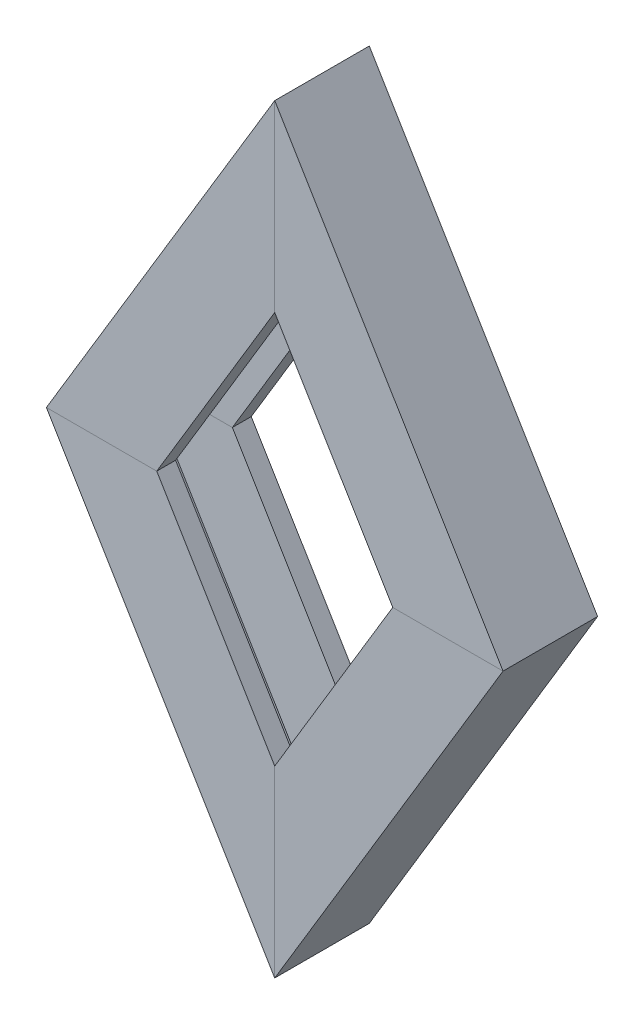
ISO-10303-21;
HEADER;
FILE_DESCRIPTION(('STEP AP214'),'2;1');
FILE_NAME('part.step','',(''),(''),'','','');
FILE_SCHEMA(('AUTOMOTIVE_DESIGN { 1 0 10303 214 1 1 1 1 }'));
ENDSEC;
DATA;
#1=APPLICATION_CONTEXT('core data for automotive mechanical design processes');
#2=APPLICATION_PROTOCOL_DEFINITION('international standard','automotive_design',2000,#1);
#3=PRODUCT_CONTEXT('',#1,'mechanical');
#4=PRODUCT('Part','Part','',(#3));
#5=PRODUCT_RELATED_PRODUCT_CATEGORY('part','',(#4));
#6=PRODUCT_DEFINITION_FORMATION('','',#4);
#7=PRODUCT_DEFINITION_CONTEXT('part definition',#1,'design');
#8=PRODUCT_DEFINITION('design','',#6,#7);
#9=PRODUCT_DEFINITION_SHAPE('','',#8);
#10=(LENGTH_UNIT() NAMED_UNIT(*) SI_UNIT(.MILLI.,.METRE.));
#11=(NAMED_UNIT(*) PLANE_ANGLE_UNIT() SI_UNIT($,.RADIAN.));
#12=(NAMED_UNIT(*) SI_UNIT($,.STERADIAN.) SOLID_ANGLE_UNIT());
#13=UNCERTAINTY_MEASURE_WITH_UNIT(LENGTH_MEASURE(1.E-05),#10,'distance_accuracy_value','');
#14=(GEOMETRIC_REPRESENTATION_CONTEXT(3) GLOBAL_UNCERTAINTY_ASSIGNED_CONTEXT((#13)) GLOBAL_UNIT_ASSIGNED_CONTEXT((#10,
#11,#12)) REPRESENTATION_CONTEXT('',''));
#15=CARTESIAN_POINT('',(0.,0.,0.));
#16=DIRECTION('',(0.,0.,1.));
#17=DIRECTION('',(1.,0.,0.));
#18=AXIS2_PLACEMENT_3D('',#15,#16,#17);
#19=CARTESIAN_POINT('',(21.4285714285715,291.923031159057,-15.0000000000001));
#20=DIRECTION('',(-0.857142857142858,0.515078753637713,0.));
#21=DIRECTION('',(-0.515078753637713,-0.857142857142857,0.));
#22=AXIS2_PLACEMENT_3D('',#19,#20,#21);
#23=PLANE('',#22);
#24=DIRECTION('',(0.,0.,1.));
#25=VECTOR('',#24,1.);
#26=CARTESIAN_POINT('',(-62.4143357301187,152.4,-14.9999999999995));
#27=LINE('',#26,#25);
#28=CARTESIAN_POINT('',(-62.4143357301187,152.4,-25.0000000000001));
#29=VERTEX_POINT('',#28);
#30=CARTESIAN_POINT('',(-62.4143357301187,152.4,-15.0000000000001));
#31=VERTEX_POINT('',#30);
#32=EDGE_CURVE('E149',#29,#31,#27,.T.);
#33=ORIENTED_EDGE('',*,*,#32,.F.);
#34=DIRECTION('',(-0.515078753637713,-0.857142857142857,0.));
#35=VECTOR('',#34,1.);
#36=CARTESIAN_POINT('',(21.4285714285714,291.923031159057,-25.0000000000001));
#37=LINE('',#36,#35);
#38=CARTESIAN_POINT('',(0.,256.263732830292,-25.0000000000001));
#39=VERTEX_POINT('',#38);
#40=EDGE_CURVE('E180',#39,#29,#37,.T.);
#41=ORIENTED_EDGE('',*,*,#40,.F.);
#42=DIRECTION('',(0.,0.,-1.));
#43=VECTOR('',#42,1.);
#44=CARTESIAN_POINT('',(0.,256.263732830292,-15.));
#45=LINE('',#44,#43);
#46=CARTESIAN_POINT('',(0.,256.263732830292,-15.0000000000001));
#47=VERTEX_POINT('',#46);
#48=EDGE_CURVE('E140',#47,#39,#45,.T.);
#49=ORIENTED_EDGE('',*,*,#48,.F.);
#50=DIRECTION('',(-0.515078753637713,-0.857142857142857,0.));
#51=VECTOR('',#50,1.);
#52=CARTESIAN_POINT('',(21.4285714285715,291.923031159057,-15.0000000000001));
#53=LINE('',#52,#51);
#54=EDGE_CURVE('E79',#47,#31,#53,.T.);
#55=ORIENTED_EDGE('',*,*,#54,.T.);
#56=EDGE_LOOP('',(#33,#41,#49,#55));
#57=FACE_BOUND('',#56,.T.);
#58=ADVANCED_FACE('F75',(#57),#23,.F.);
#59=CARTESIAN_POINT('',(21.4285714285714,291.923031159057,-25.0000000000001));
#60=DIRECTION('',(0.,0.,1.));
#61=DIRECTION('',(1.,0.,0.));
#62=AXIS2_PLACEMENT_3D('',#59,#60,#61);
#63=PLANE('',#62);
#64=DIRECTION('',(1.,0.,0.));
#65=VECTOR('',#64,1.);
#66=CARTESIAN_POINT('',(21.4285714285715,152.4,-25.0000000000004));
#67=LINE('',#66,#65);
#68=CARTESIAN_POINT('',(-120.747669063452,152.4,-24.9999999999999));
#69=VERTEX_POINT('',#68);
#70=EDGE_CURVE('E146',#69,#29,#67,.T.);
#71=ORIENTED_EDGE('',*,*,#70,.F.);
#72=DIRECTION('',(-0.515078753637713,-0.857142857142857,0.));
#73=VECTOR('',#72,1.);
#74=CARTESIAN_POINT('',(-21.4285714285715,317.676968840943,-24.9999999999999));
#75=LINE('',#74,#73);
#76=CARTESIAN_POINT('',(0.,353.336267169708,-24.9999999999999));
#77=VERTEX_POINT('',#76);
#78=EDGE_CURVE('E178',#77,#69,#75,.T.);
#79=ORIENTED_EDGE('',*,*,#78,.F.);
#80=DIRECTION('',(0.,1.,0.));
#81=VECTOR('',#80,1.);
#82=CARTESIAN_POINT('',(0.,291.923031159057,-25.));
#83=LINE('',#82,#81);
#84=EDGE_CURVE('E204',#39,#77,#83,.T.);
#85=ORIENTED_EDGE('',*,*,#84,.F.);
#86=ORIENTED_EDGE('',*,*,#40,.T.);
#87=EDGE_LOOP('',(#71,#79,#85,#86));
#88=FACE_BOUND('',#87,.T.);
#89=ADVANCED_FACE('F194',(#88),#63,.F.);
#90=CARTESIAN_POINT('',(-21.4285714285715,317.676968840943,-24.9999999999999));
#91=DIRECTION('',(0.857142857142858,-0.515078753637713,0.));
#92=DIRECTION('',(0.515078753637713,0.857142857142857,0.));
#93=AXIS2_PLACEMENT_3D('',#90,#91,#92);
#94=PLANE('',#93);
#95=DIRECTION('',(0.,0.,-1.));
#96=VECTOR('',#95,1.);
#97=CARTESIAN_POINT('',(-120.747669063452,152.4,-24.9999999999991));
#98=LINE('',#97,#96);
#99=CARTESIAN_POINT('',(-120.747669063452,152.4,25.0000000000001));
#100=VERTEX_POINT('',#99);
#101=EDGE_CURVE('E14',#100,#69,#98,.T.);
#102=ORIENTED_EDGE('',*,*,#101,.F.);
#103=DIRECTION('',(-0.515078753637713,-0.857142857142857,0.));
#104=VECTOR('',#103,1.);
#105=CARTESIAN_POINT('',(-21.4285714285713,317.676968840943,25.0000000000001));
#106=LINE('',#105,#104);
#107=CARTESIAN_POINT('',(0.,353.336267169707,25.0000000000001));
#108=VERTEX_POINT('',#107);
#109=EDGE_CURVE('E175',#108,#100,#106,.T.);
#110=ORIENTED_EDGE('',*,*,#109,.F.);
#111=DIRECTION('',(0.,0.,1.));
#112=VECTOR('',#111,1.);
#113=CARTESIAN_POINT('',(0.,353.336267169708,-24.9999999999999));
#114=LINE('',#113,#112);
#115=EDGE_CURVE('E201',#77,#108,#114,.T.);
#116=ORIENTED_EDGE('',*,*,#115,.F.);
#117=ORIENTED_EDGE('',*,*,#78,.T.);
#118=EDGE_LOOP('',(#102,#110,#116,#117));
#119=FACE_BOUND('',#118,.T.);
#120=ADVANCED_FACE('F198',(#119),#94,.F.);
#121=CARTESIAN_POINT('',(-21.4285714285713,317.676968840943,25.0000000000001));
#122=DIRECTION('',(0.,0.,-1.));
#123=DIRECTION('',(-1.,0.,0.));
#124=AXIS2_PLACEMENT_3D('',#121,#122,#123);
#125=PLANE('',#124);
#126=DIRECTION('',(-1.,0.,0.));
#127=VECTOR('',#126,1.);
#128=CARTESIAN_POINT('',(-21.4285714285713,152.4,24.9999999999998));
#129=LINE('',#128,#127);
#130=CARTESIAN_POINT('',(-62.4143357301184,152.4,24.9999999999999));
#131=VERTEX_POINT('',#130);
#132=EDGE_CURVE('E84',#131,#100,#129,.T.);
#133=ORIENTED_EDGE('',*,*,#132,.F.);
#134=DIRECTION('',(-0.515078753637713,-0.857142857142857,0.));
#135=VECTOR('',#134,1.);
#136=CARTESIAN_POINT('',(21.4285714285716,291.923031159057,24.9999999999999));
#137=LINE('',#136,#135);
#138=CARTESIAN_POINT('',(0.,256.263732830292,24.9999999999999));
#139=VERTEX_POINT('',#138);
#140=EDGE_CURVE('E172',#139,#131,#137,.T.);
#141=ORIENTED_EDGE('',*,*,#140,.F.);
#142=DIRECTION('',(0.,-1.,0.));
#143=VECTOR('',#142,1.);
#144=CARTESIAN_POINT('',(0.,317.676968840943,25.));
#145=LINE('',#144,#143);
#146=EDGE_CURVE('E203',#108,#139,#145,.T.);
#147=ORIENTED_EDGE('',*,*,#146,.F.);
#148=ORIENTED_EDGE('',*,*,#109,.T.);
#149=EDGE_LOOP('',(#133,#141,#147,#148));
#150=FACE_BOUND('',#149,.T.);
#151=ADVANCED_FACE('F216',(#150),#125,.F.);
#152=CARTESIAN_POINT('',(21.4285714285716,291.923031159057,24.9999999999999));
#153=DIRECTION('',(-0.857142857142858,0.515078753637713,0.));
#154=DIRECTION('',(-0.515078753637713,-0.857142857142857,0.));
#155=AXIS2_PLACEMENT_3D('',#152,#153,#154);
#156=PLANE('',#155);
#157=DIRECTION('',(0.,0.,1.));
#158=VECTOR('',#157,1.);
#159=CARTESIAN_POINT('',(-62.4143357301184,152.4,25.0000000000006));
#160=LINE('',#159,#158);
#161=CARTESIAN_POINT('',(-62.4143357301185,152.4,14.9999999999999));
#162=VERTEX_POINT('',#161);
#163=EDGE_CURVE('E160',#162,#131,#160,.T.);
#164=ORIENTED_EDGE('',*,*,#163,.F.);
#165=DIRECTION('',(-0.515078753637713,-0.857142857142857,0.));
#166=VECTOR('',#165,1.);
#167=CARTESIAN_POINT('',(21.4285714285716,291.923031159057,14.9999999999999));
#168=LINE('',#167,#166);
#169=CARTESIAN_POINT('',(0.,256.263732830292,14.9999999999999));
#170=VERTEX_POINT('',#169);
#171=EDGE_CURVE('E169',#170,#162,#168,.T.);
#172=ORIENTED_EDGE('',*,*,#171,.F.);
#173=DIRECTION('',(0.,0.,-1.));
#174=VECTOR('',#173,1.);
#175=CARTESIAN_POINT('',(1.04083408558608E-13,256.263732830292,24.9999999999999));
#176=LINE('',#175,#174);
#177=EDGE_CURVE('E151',#139,#170,#176,.T.);
#178=ORIENTED_EDGE('',*,*,#177,.F.);
#179=ORIENTED_EDGE('',*,*,#140,.T.);
#180=EDGE_LOOP('',(#164,#172,#178,#179));
#181=FACE_BOUND('',#180,.T.);
#182=ADVANCED_FACE('F213',(#181),#156,.F.);
#183=CARTESIAN_POINT('',(21.4285714285716,291.923031159057,14.9999999999999));
#184=DIRECTION('',(0.,0.,1.));
#185=DIRECTION('',(1.,0.,0.));
#186=AXIS2_PLACEMENT_3D('',#183,#184,#185);
#187=PLANE('',#186);
#188=DIRECTION('',(1.,0.,0.));
#189=VECTOR('',#188,1.);
#190=CARTESIAN_POINT('',(21.4285714285717,152.4,14.9999999999997));
#191=LINE('',#190,#189);
#192=CARTESIAN_POINT('',(-109.081002396785,152.4,15.0000000000001));
#193=VERTEX_POINT('',#192);
#194=EDGE_CURVE('E163',#193,#162,#191,.T.);
#195=ORIENTED_EDGE('',*,*,#194,.F.);
#196=DIRECTION('',(-0.515078753637713,-0.857142857142857,0.));
#197=VECTOR('',#196,1.);
#198=CARTESIAN_POINT('',(-12.8571428571428,312.526181304566,15.0000000000001));
#199=LINE('',#198,#197);
#200=CARTESIAN_POINT('',(0.,333.921760301824,15.0000000000001));
#201=VERTEX_POINT('',#200);
#202=EDGE_CURVE('E134',#201,#193,#199,.T.);
#203=ORIENTED_EDGE('',*,*,#202,.F.);
#204=DIRECTION('',(0.,1.,0.));
#205=VECTOR('',#204,1.);
#206=CARTESIAN_POINT('',(0.,291.923031159057,15.));
#207=LINE('',#206,#205);
#208=EDGE_CURVE('E145',#170,#201,#207,.T.);
#209=ORIENTED_EDGE('',*,*,#208,.F.);
#210=ORIENTED_EDGE('',*,*,#171,.T.);
#211=EDGE_LOOP('',(#195,#203,#209,#210));
#212=FACE_BOUND('',#211,.T.);
#213=ADVANCED_FACE('F221',(#212),#187,.F.);
#214=CARTESIAN_POINT('',(-12.8571428571428,312.526181304566,15.0000000000001));
#215=DIRECTION('',(-0.857142857142858,0.515078753637713,0.));
#216=DIRECTION('',(-0.515078753637713,-0.857142857142857,0.));
#217=AXIS2_PLACEMENT_3D('',#214,#215,#216);
#218=PLANE('',#217);
#219=DIRECTION('',(0.,0.,1.));
#220=VECTOR('',#219,1.);
#221=CARTESIAN_POINT('',(-109.081002396785,152.4,15.0000000000008));
#222=LINE('',#221,#220);
#223=CARTESIAN_POINT('',(-109.081002396785,152.4,-15.));
#224=VERTEX_POINT('',#223);
#225=EDGE_CURVE('E131',#224,#193,#222,.T.);
#226=ORIENTED_EDGE('',*,*,#225,.F.);
#227=DIRECTION('',(-0.515078753637713,-0.857142857142857,0.));
#228=VECTOR('',#227,1.);
#229=CARTESIAN_POINT('',(-12.8571428571429,312.526181304566,-15.));
#230=LINE('',#229,#228);
#231=CARTESIAN_POINT('',(0.,333.921760301825,-15.));
#232=VERTEX_POINT('',#231);
#233=EDGE_CURVE('E92',#232,#224,#230,.T.);
#234=ORIENTED_EDGE('',*,*,#233,.F.);
#235=DIRECTION('',(0.,0.,-1.));
#236=VECTOR('',#235,1.);
#237=CARTESIAN_POINT('',(0.,333.921760301824,15.0000000000001));
#238=LINE('',#237,#236);
#239=EDGE_CURVE('E128',#201,#232,#238,.T.);
#240=ORIENTED_EDGE('',*,*,#239,.F.);
#241=ORIENTED_EDGE('',*,*,#202,.T.);
#242=EDGE_LOOP('',(#226,#234,#240,#241));
#243=FACE_BOUND('',#242,.T.);
#244=ADVANCED_FACE('F125',(#243),#218,.F.);
#245=CARTESIAN_POINT('',(-12.8571428571429,312.526181304566,-15.));
#246=DIRECTION('',(0.,0.,-1.));
#247=DIRECTION('',(-1.,0.,0.));
#248=AXIS2_PLACEMENT_3D('',#245,#246,#247);
#249=PLANE('',#248);
#250=DIRECTION('',(-1.,0.,0.));
#251=VECTOR('',#250,1.);
#252=CARTESIAN_POINT('',(-12.8571428571428,152.4,-15.0000000000002));
#253=LINE('',#252,#251);
#254=EDGE_CURVE('E156',#31,#224,#253,.T.);
#255=ORIENTED_EDGE('',*,*,#254,.F.);
#256=ORIENTED_EDGE('',*,*,#54,.F.);
#257=DIRECTION('',(0.,-1.,0.));
#258=VECTOR('',#257,1.);
#259=CARTESIAN_POINT('',(0.,312.526181304566,-15.));
#260=LINE('',#259,#258);
#261=EDGE_CURVE('E133',#232,#47,#260,.T.);
#262=ORIENTED_EDGE('',*,*,#261,.F.);
#263=ORIENTED_EDGE('',*,*,#233,.T.);
#264=EDGE_LOOP('',(#255,#256,#262,#263));
#265=FACE_BOUND('',#264,.T.);
#266=ADVANCED_FACE('F137',(#265),#249,.F.);
#267=CARTESIAN_POINT('',(0.,304.8,0.));
#268=DIRECTION('',(1.,0.,0.));
#269=DIRECTION('',(0.,0.,-1.));
#270=AXIS2_PLACEMENT_3D('',#267,#268,#269);
#271=PLANE('',#270);
#272=ORIENTED_EDGE('',*,*,#261,.T.);
#273=ORIENTED_EDGE('',*,*,#48,.T.);
#274=ORIENTED_EDGE('',*,*,#84,.T.);
#275=ORIENTED_EDGE('',*,*,#115,.T.);
#276=ORIENTED_EDGE('',*,*,#146,.T.);
#277=ORIENTED_EDGE('',*,*,#177,.T.);
#278=ORIENTED_EDGE('',*,*,#208,.T.);
#279=ORIENTED_EDGE('',*,*,#239,.T.);
#280=EDGE_LOOP('',(#272,#273,#274,#275,#276,#277,#278,#279));
#281=FACE_BOUND('',#280,.T.);
#282=ADVANCED_FACE('F143',(#281),#271,.T.);
#283=CARTESIAN_POINT('',(-91.5810023967853,152.4,0.));
#284=DIRECTION('',(0.,-1.,0.));
#285=DIRECTION('',(0.,0.,-1.));
#286=AXIS2_PLACEMENT_3D('',#283,#284,#285);
#287=PLANE('',#286);
#288=ORIENTED_EDGE('',*,*,#70,.T.);
#289=ORIENTED_EDGE('',*,*,#32,.T.);
#290=ORIENTED_EDGE('',*,*,#254,.T.);
#291=ORIENTED_EDGE('',*,*,#225,.T.);
#292=ORIENTED_EDGE('',*,*,#194,.T.);
#293=ORIENTED_EDGE('',*,*,#163,.T.);
#294=ORIENTED_EDGE('',*,*,#132,.T.);
#295=ORIENTED_EDGE('',*,*,#101,.T.);
#296=EDGE_LOOP('',(#288,#289,#290,#291,#292,#293,#294,#295));
#297=FACE_BOUND('',#296,.T.);
#298=ADVANCED_FACE('F77',(#297),#287,.T.);
#299=CLOSED_SHELL('',(#58,#89,#120,#151,#182,#213,#244,#266,#282,#298));
#300=MANIFOLD_SOLID_BREP('B2',#299);
#301=CARTESIAN_POINT('',(-70.1524309682139,165.276968840943,-15.0000000000001));
#302=DIRECTION('',(-0.857142857142858,-0.515078753637713,0.));
#303=DIRECTION('',(0.515078753637713,-0.857142857142857,0.));
#304=AXIS2_PLACEMENT_3D('',#301,#302,#303);
#305=PLANE('',#304);
#306=DIRECTION('',(0.,0.,-1.));
#307=VECTOR('',#306,1.);
#308=CARTESIAN_POINT('',(-62.4143357301187,152.4,-15.0000000000001));
#309=LINE('',#308,#307);
#310=CARTESIAN_POINT('',(-62.4143357301187,152.4,-15.0000000000001));
#311=VERTEX_POINT('',#310);
#312=CARTESIAN_POINT('',(-62.4143357301187,152.4,-25.0000000000001));
#313=VERTEX_POINT('',#312);
#314=EDGE_CURVE('E448',#311,#313,#309,.T.);
#315=ORIENTED_EDGE('',*,*,#314,.F.);
#316=DIRECTION('',(0.515078753637713,-0.857142857142857,0.));
#317=VECTOR('',#316,1.);
#318=CARTESIAN_POINT('',(-70.1524309682139,165.276968840943,-15.0000000000001));
#319=LINE('',#318,#317);
#320=CARTESIAN_POINT('',(0.,48.5362671697074,-15.0000000000001));
#321=VERTEX_POINT('',#320);
#322=EDGE_CURVE('E353',#311,#321,#319,.T.);
#323=ORIENTED_EDGE('',*,*,#322,.T.);
#324=DIRECTION('',(0.,0.,1.));
#325=VECTOR('',#324,1.);
#326=CARTESIAN_POINT('',(0.,48.5362671697074,-14.9999999999988));
#327=LINE('',#326,#325);
#328=CARTESIAN_POINT('',(0.,48.5362671697073,-25.0000000000001));
#329=VERTEX_POINT('',#328);
#330=EDGE_CURVE('E467',#329,#321,#327,.T.);
#331=ORIENTED_EDGE('',*,*,#330,.F.);
#332=DIRECTION('',(0.515078753637713,-0.857142857142857,0.));
#333=VECTOR('',#332,1.);
#334=CARTESIAN_POINT('',(-70.1524309682139,165.276968840943,-25.0000000000001));
#335=LINE('',#334,#333);
#336=EDGE_CURVE('E461',#313,#329,#335,.T.);
#337=ORIENTED_EDGE('',*,*,#336,.F.);
#338=EDGE_LOOP('',(#315,#323,#331,#337));
#339=FACE_BOUND('',#338,.T.);
#340=ADVANCED_FACE('F349',(#339),#305,.F.);
#341=CARTESIAN_POINT('',(-70.1524309682139,165.276968840943,-25.0000000000001));
#342=DIRECTION('',(0.,0.,1.));
#343=DIRECTION('',(1.,0.,0.));
#344=AXIS2_PLACEMENT_3D('',#341,#342,#343);
#345=PLANE('',#344);
#346=DIRECTION('',(-1.,0.,0.));
#347=VECTOR('',#346,1.);
#348=CARTESIAN_POINT('',(-70.1524309682139,152.4,-25.0000000000001));
#349=LINE('',#348,#347);
#350=CARTESIAN_POINT('',(-120.747669063452,152.4,-24.9999999999999));
#351=VERTEX_POINT('',#350);
#352=EDGE_CURVE('E408',#313,#351,#349,.T.);
#353=ORIENTED_EDGE('',*,*,#352,.F.);
#354=ORIENTED_EDGE('',*,*,#336,.T.);
#355=DIRECTION('',(0.,1.,0.));
#356=VECTOR('',#355,1.);
#357=CARTESIAN_POINT('',(0.,165.276968840943,-25.0000000000003));
#358=LINE('',#357,#356);
#359=CARTESIAN_POINT('',(0.,-48.5362671697076,-24.9999999999999));
#360=VERTEX_POINT('',#359);
#361=EDGE_CURVE('E455',#360,#329,#358,.T.);
#362=ORIENTED_EDGE('',*,*,#361,.F.);
#363=DIRECTION('',(0.515078753637713,-0.857142857142857,0.));
#364=VECTOR('',#363,1.);
#365=CARTESIAN_POINT('',(-113.009573825357,139.523031159057,-24.9999999999999));
#366=LINE('',#365,#364);
#367=EDGE_CURVE('E460',#351,#360,#366,.T.);
#368=ORIENTED_EDGE('',*,*,#367,.F.);
#369=EDGE_LOOP('',(#353,#354,#362,#368));
#370=FACE_BOUND('',#369,.T.);
#371=ADVANCED_FACE('F463',(#370),#345,.F.);
#372=CARTESIAN_POINT('',(-113.009573825357,139.523031159057,-24.9999999999999));
#373=DIRECTION('',(0.857142857142858,0.515078753637713,0.));
#374=DIRECTION('',(-0.515078753637713,0.857142857142857,0.));
#375=AXIS2_PLACEMENT_3D('',#372,#373,#374);
#376=PLANE('',#375);
#377=DIRECTION('',(0.,0.,1.));
#378=VECTOR('',#377,1.);
#379=CARTESIAN_POINT('',(-120.747669063452,152.4,-24.9999999999999));
#380=LINE('',#379,#378);
#381=CARTESIAN_POINT('',(-120.747669063452,152.4,25.0000000000001));
#382=VERTEX_POINT('',#381);
#383=EDGE_CURVE('E443',#351,#382,#380,.T.);
#384=ORIENTED_EDGE('',*,*,#383,.F.);
#385=ORIENTED_EDGE('',*,*,#367,.T.);
#386=DIRECTION('',(0.,0.,-1.));
#387=VECTOR('',#386,1.);
#388=CARTESIAN_POINT('',(0.,-48.5362671697078,-24.9999999999975));
#389=LINE('',#388,#387);
#390=CARTESIAN_POINT('',(0.,-48.5362671697072,25.0000000000001));
#391=VERTEX_POINT('',#390);
#392=EDGE_CURVE('E453',#391,#360,#389,.T.);
#393=ORIENTED_EDGE('',*,*,#392,.F.);
#394=DIRECTION('',(0.515078753637713,-0.857142857142857,0.));
#395=VECTOR('',#394,1.);
#396=CARTESIAN_POINT('',(-113.009573825357,139.523031159057,25.0000000000001));
#397=LINE('',#396,#395);
#398=EDGE_CURVE('E458',#382,#391,#397,.T.);
#399=ORIENTED_EDGE('',*,*,#398,.F.);
#400=EDGE_LOOP('',(#384,#385,#393,#399));
#401=FACE_BOUND('',#400,.T.);
#402=ADVANCED_FACE('F501',(#401),#376,.F.);
#403=CARTESIAN_POINT('',(-113.009573825357,139.523031159057,25.0000000000001));
#404=DIRECTION('',(0.,0.,-1.));
#405=DIRECTION('',(-1.,0.,0.));
#406=AXIS2_PLACEMENT_3D('',#403,#404,#405);
#407=PLANE('',#406);
#408=DIRECTION('',(1.,0.,0.));
#409=VECTOR('',#408,1.);
#410=CARTESIAN_POINT('',(-113.009573825357,152.4,25.0000000000001));
#411=LINE('',#410,#409);
#412=CARTESIAN_POINT('',(-62.4143357301186,152.4,24.9999999999999));
#413=VERTEX_POINT('',#412);
#414=EDGE_CURVE('E441',#382,#413,#411,.T.);
#415=ORIENTED_EDGE('',*,*,#414,.F.);
#416=ORIENTED_EDGE('',*,*,#398,.T.);
#417=DIRECTION('',(0.,-1.,0.));
#418=VECTOR('',#417,1.);
#419=CARTESIAN_POINT('',(0.,139.523031159057,24.9999999999998));
#420=LINE('',#419,#418);
#421=CARTESIAN_POINT('',(0.,48.5362671697078,24.9999999999999));
#422=VERTEX_POINT('',#421);
#423=EDGE_CURVE('E478',#422,#391,#420,.T.);
#424=ORIENTED_EDGE('',*,*,#423,.F.);
#425=DIRECTION('',(0.515078753637713,-0.857142857142857,0.));
#426=VECTOR('',#425,1.);
#427=CARTESIAN_POINT('',(-70.1524309682138,165.276968840943,24.9999999999999));
#428=LINE('',#427,#426);
#429=EDGE_CURVE('E436',#413,#422,#428,.T.);
#430=ORIENTED_EDGE('',*,*,#429,.F.);
#431=EDGE_LOOP('',(#415,#416,#424,#430));
#432=FACE_BOUND('',#431,.T.);
#433=ADVANCED_FACE('F506',(#432),#407,.F.);
#434=CARTESIAN_POINT('',(-70.1524309682138,165.276968840943,24.9999999999999));
#435=DIRECTION('',(-0.857142857142858,-0.515078753637713,0.));
#436=DIRECTION('',(0.515078753637713,-0.857142857142857,0.));
#437=AXIS2_PLACEMENT_3D('',#434,#435,#436);
#438=PLANE('',#437);
#439=DIRECTION('',(0.,0.,-1.));
#440=VECTOR('',#439,1.);
#441=CARTESIAN_POINT('',(-62.4143357301186,152.4,24.9999999999999));
#442=LINE('',#441,#440);
#443=CARTESIAN_POINT('',(-62.4143357301186,152.4,14.9999999999999));
#444=VERTEX_POINT('',#443);
#445=EDGE_CURVE('E428',#413,#444,#442,.T.);
#446=ORIENTED_EDGE('',*,*,#445,.F.);
#447=ORIENTED_EDGE('',*,*,#429,.T.);
#448=DIRECTION('',(0.,0.,1.));
#449=VECTOR('',#448,1.);
#450=CARTESIAN_POINT('',(0.,48.5362671697079,25.0000000000015));
#451=LINE('',#450,#449);
#452=CARTESIAN_POINT('',(0.,48.5362671697077,14.9999999999999));
#453=VERTEX_POINT('',#452);
#454=EDGE_CURVE('E434',#453,#422,#451,.T.);
#455=ORIENTED_EDGE('',*,*,#454,.F.);
#456=DIRECTION('',(0.515078753637713,-0.857142857142857,0.));
#457=VECTOR('',#456,1.);
#458=CARTESIAN_POINT('',(-70.1524309682138,165.276968840943,14.9999999999999));
#459=LINE('',#458,#457);
#460=EDGE_CURVE('E423',#444,#453,#459,.T.);
#461=ORIENTED_EDGE('',*,*,#460,.F.);
#462=EDGE_LOOP('',(#446,#447,#455,#461));
#463=FACE_BOUND('',#462,.T.);
#464=ADVANCED_FACE('F431',(#463),#438,.F.);
#465=CARTESIAN_POINT('',(-70.1524309682138,165.276968840943,14.9999999999999));
#466=DIRECTION('',(0.,0.,1.));
#467=DIRECTION('',(1.,0.,0.));
#468=AXIS2_PLACEMENT_3D('',#465,#466,#467);
#469=PLANE('',#468);
#470=DIRECTION('',(-1.,0.,0.));
#471=VECTOR('',#470,1.);
#472=CARTESIAN_POINT('',(-70.1524309682138,152.4,14.9999999999999));
#473=LINE('',#472,#471);
#474=CARTESIAN_POINT('',(-109.081002396785,152.4,15.0000000000001));
#475=VERTEX_POINT('',#474);
#476=EDGE_CURVE('E358',#444,#475,#473,.T.);
#477=ORIENTED_EDGE('',*,*,#476,.F.);
#478=ORIENTED_EDGE('',*,*,#460,.T.);
#479=DIRECTION('',(0.,1.,0.));
#480=VECTOR('',#479,1.);
#481=CARTESIAN_POINT('',(0.,165.276968840943,14.9999999999997));
#482=LINE('',#481,#480);
#483=CARTESIAN_POINT('',(0.,-29.1217603018245,15.0000000000001));
#484=VERTEX_POINT('',#483);
#485=EDGE_CURVE('E481',#484,#453,#482,.T.);
#486=ORIENTED_EDGE('',*,*,#485,.F.);
#487=DIRECTION('',(0.515078753637713,-0.857142857142857,0.));
#488=VECTOR('',#487,1.);
#489=CARTESIAN_POINT('',(-104.438145253928,144.673818695434,15.0000000000001));
#490=LINE('',#489,#488);
#491=EDGE_CURVE('E425',#475,#484,#490,.T.);
#492=ORIENTED_EDGE('',*,*,#491,.F.);
#493=EDGE_LOOP('',(#477,#478,#486,#492));
#494=FACE_BOUND('',#493,.T.);
#495=ADVANCED_FACE('F421',(#494),#469,.F.);
#496=CARTESIAN_POINT('',(-104.438145253928,144.673818695434,15.0000000000001));
#497=DIRECTION('',(-0.857142857142858,-0.515078753637713,0.));
#498=DIRECTION('',(0.515078753637713,-0.857142857142857,0.));
#499=AXIS2_PLACEMENT_3D('',#496,#497,#498);
#500=PLANE('',#499);
#501=DIRECTION('',(0.,0.,-1.));
#502=VECTOR('',#501,1.);
#503=CARTESIAN_POINT('',(-109.081002396785,152.4,15.0000000000001));
#504=LINE('',#503,#502);
#505=CARTESIAN_POINT('',(-109.081002396785,152.4,-15.));
#506=VERTEX_POINT('',#505);
#507=EDGE_CURVE('E73',#475,#506,#504,.T.);
#508=ORIENTED_EDGE('',*,*,#507,.F.);
#509=ORIENTED_EDGE('',*,*,#491,.T.);
#510=DIRECTION('',(0.,0.,1.));
#511=VECTOR('',#510,1.);
#512=CARTESIAN_POINT('',(0.,-29.1217603018243,15.0000000000023));
#513=LINE('',#512,#511);
#514=CARTESIAN_POINT('',(0.,-29.1217603018247,-15.));
#515=VERTEX_POINT('',#514);
#516=EDGE_CURVE('E483',#515,#484,#513,.T.);
#517=ORIENTED_EDGE('',*,*,#516,.F.);
#518=DIRECTION('',(0.515078753637713,-0.857142857142857,0.));
#519=VECTOR('',#518,1.);
#520=CARTESIAN_POINT('',(-104.438145253928,144.673818695434,-15.));
#521=LINE('',#520,#519);
#522=EDGE_CURVE('E371',#506,#515,#521,.T.);
#523=ORIENTED_EDGE('',*,*,#522,.F.);
#524=EDGE_LOOP('',(#508,#509,#517,#523));
#525=FACE_BOUND('',#524,.T.);
#526=ADVANCED_FACE('F488',(#525),#500,.F.);
#527=CARTESIAN_POINT('',(-104.438145253928,144.673818695434,-15.));
#528=DIRECTION('',(0.,0.,-1.));
#529=DIRECTION('',(-1.,0.,0.));
#530=AXIS2_PLACEMENT_3D('',#527,#528,#529);
#531=PLANE('',#530);
#532=DIRECTION('',(1.,0.,0.));
#533=VECTOR('',#532,1.);
#534=CARTESIAN_POINT('',(-104.438145253928,152.4,-15.));
#535=LINE('',#534,#533);
#536=EDGE_CURVE('E451',#506,#311,#535,.T.);
#537=ORIENTED_EDGE('',*,*,#536,.F.);
#538=ORIENTED_EDGE('',*,*,#522,.T.);
#539=DIRECTION('',(0.,-1.,0.));
#540=VECTOR('',#539,1.);
#541=CARTESIAN_POINT('',(0.,144.673818695434,-15.0000000000003));
#542=LINE('',#541,#540);
#543=EDGE_CURVE('E470',#321,#515,#542,.T.);
#544=ORIENTED_EDGE('',*,*,#543,.F.);
#545=ORIENTED_EDGE('',*,*,#322,.F.);
#546=EDGE_LOOP('',(#537,#538,#544,#545));
#547=FACE_BOUND('',#546,.T.);
#548=ADVANCED_FACE('F486',(#547),#531,.F.);
#549=CARTESIAN_POINT('',(0.,0.,0.));
#550=DIRECTION('',(1.,0.,0.));
#551=DIRECTION('',(0.,0.,-1.));
#552=AXIS2_PLACEMENT_3D('',#549,#550,#551);
#553=PLANE('',#552);
#554=ORIENTED_EDGE('',*,*,#361,.T.);
#555=ORIENTED_EDGE('',*,*,#330,.T.);
#556=ORIENTED_EDGE('',*,*,#543,.T.);
#557=ORIENTED_EDGE('',*,*,#516,.T.);
#558=ORIENTED_EDGE('',*,*,#485,.T.);
#559=ORIENTED_EDGE('',*,*,#454,.T.);
#560=ORIENTED_EDGE('',*,*,#423,.T.);
#561=ORIENTED_EDGE('',*,*,#392,.T.);
#562=EDGE_LOOP('',(#554,#555,#556,#557,#558,#559,#560,#561));
#563=FACE_BOUND('',#562,.T.);
#564=ADVANCED_FACE('F472',(#563),#553,.T.);
#565=CARTESIAN_POINT('',(-91.5810023967853,152.4,0.));
#566=DIRECTION('',(0.,1.,0.));
#567=DIRECTION('',(0.,0.,1.));
#568=AXIS2_PLACEMENT_3D('',#565,#566,#567);
#569=PLANE('',#568);
#570=ORIENTED_EDGE('',*,*,#536,.T.);
#571=ORIENTED_EDGE('',*,*,#314,.T.);
#572=ORIENTED_EDGE('',*,*,#352,.T.);
#573=ORIENTED_EDGE('',*,*,#383,.T.);
#574=ORIENTED_EDGE('',*,*,#414,.T.);
#575=ORIENTED_EDGE('',*,*,#445,.T.);
#576=ORIENTED_EDGE('',*,*,#476,.T.);
#577=ORIENTED_EDGE('',*,*,#507,.T.);
#578=EDGE_LOOP('',(#570,#571,#572,#573,#574,#575,#576,#577));
#579=FACE_BOUND('',#578,.T.);
#580=ADVANCED_FACE('F351',(#579),#569,.T.);
#581=CLOSED_SHELL('',(#340,#371,#402,#433,#464,#495,#526,#548,#564,#580));
#582=MANIFOLD_SOLID_BREP('B8',#581);
#583=CARTESIAN_POINT('',(70.1524309682139,139.523031159057,-15.0000000000001));
#584=DIRECTION('',(0.857142857142857,0.515078753637713,0.));
#585=DIRECTION('',(-0.515078753637713,0.857142857142857,0.));
#586=AXIS2_PLACEMENT_3D('',#583,#584,#585);
#587=PLANE('',#586);
#588=DIRECTION('',(0.,0.,1.));
#589=VECTOR('',#588,1.);
#590=CARTESIAN_POINT('',(0.,256.263732830293,-14.9999999999988));
#591=LINE('',#590,#589);
#592=CARTESIAN_POINT('',(0.,256.263732830293,-25.0000000000001));
#593=VERTEX_POINT('',#592);
#594=CARTESIAN_POINT('',(0.,256.263732830293,-15.0000000000001));
#595=VERTEX_POINT('',#594);
#596=EDGE_CURVE('E696',#593,#595,#591,.T.);
#597=ORIENTED_EDGE('',*,*,#596,.F.);
#598=DIRECTION('',(-0.515078753637713,0.857142857142857,0.));
#599=VECTOR('',#598,1.);
#600=CARTESIAN_POINT('',(70.1524309682139,139.523031159057,-25.0000000000001));
#601=LINE('',#600,#599);
#602=CARTESIAN_POINT('',(62.4143357301186,152.4,-25.0000000000001));
#603=VERTEX_POINT('',#602);
#604=EDGE_CURVE('E727',#603,#593,#601,.T.);
#605=ORIENTED_EDGE('',*,*,#604,.F.);
#606=DIRECTION('',(0.,0.,-1.));
#607=VECTOR('',#606,1.);
#608=CARTESIAN_POINT('',(62.4143357301187,152.4,-15.0000000000001));
#609=LINE('',#608,#607);
#610=CARTESIAN_POINT('',(62.4143357301187,152.4,-15.0000000000001));
#611=VERTEX_POINT('',#610);
#612=EDGE_CURVE('E687',#611,#603,#609,.T.);
#613=ORIENTED_EDGE('',*,*,#612,.F.);
#614=DIRECTION('',(-0.515078753637713,0.857142857142857,0.));
#615=VECTOR('',#614,1.);
#616=CARTESIAN_POINT('',(70.1524309682139,139.523031159057,-15.0000000000001));
#617=LINE('',#616,#615);
#618=EDGE_CURVE('E626',#611,#595,#617,.T.);
#619=ORIENTED_EDGE('',*,*,#618,.T.);
#620=EDGE_LOOP('',(#597,#605,#613,#619));
#621=FACE_BOUND('',#620,.T.);
#622=ADVANCED_FACE('F622',(#621),#587,.F.);
#623=CARTESIAN_POINT('',(70.1524309682139,139.523031159057,-25.0000000000001));
#624=DIRECTION('',(0.,0.,1.));
#625=DIRECTION('',(1.,0.,0.));
#626=AXIS2_PLACEMENT_3D('',#623,#624,#625);
#627=PLANE('',#626);
#628=DIRECTION('',(0.,-1.,0.));
#629=VECTOR('',#628,1.);
#630=CARTESIAN_POINT('',(0.,139.523031159057,-25.0000000000003));
#631=LINE('',#630,#629);
#632=CARTESIAN_POINT('',(0.,353.336267169708,-24.9999999999999));
#633=VERTEX_POINT('',#632);
#634=EDGE_CURVE('E693',#633,#593,#631,.T.);
#635=ORIENTED_EDGE('',*,*,#634,.F.);
#636=DIRECTION('',(-0.515078753637713,0.857142857142857,0.));
#637=VECTOR('',#636,1.);
#638=CARTESIAN_POINT('',(113.009573825357,165.276968840943,-24.9999999999999));
#639=LINE('',#638,#637);
#640=CARTESIAN_POINT('',(120.747669063452,152.4,-24.9999999999999));
#641=VERTEX_POINT('',#640);
#642=EDGE_CURVE('E725',#641,#633,#639,.T.);
#643=ORIENTED_EDGE('',*,*,#642,.F.);
#644=DIRECTION('',(1.,0.,0.));
#645=VECTOR('',#644,1.);
#646=CARTESIAN_POINT('',(70.1524309682139,152.4,-25.0000000000001));
#647=LINE('',#646,#645);
#648=EDGE_CURVE('E751',#603,#641,#647,.T.);
#649=ORIENTED_EDGE('',*,*,#648,.F.);
#650=ORIENTED_EDGE('',*,*,#604,.T.);
#651=EDGE_LOOP('',(#635,#643,#649,#650));
#652=FACE_BOUND('',#651,.T.);
#653=ADVANCED_FACE('F741',(#652),#627,.F.);
#654=CARTESIAN_POINT('',(113.009573825357,165.276968840943,-24.9999999999999));
#655=DIRECTION('',(-0.857142857142857,-0.515078753637713,0.));
#656=DIRECTION('',(0.515078753637713,-0.857142857142857,0.));
#657=AXIS2_PLACEMENT_3D('',#654,#655,#656);
#658=PLANE('',#657);
#659=DIRECTION('',(0.,0.,-1.));
#660=VECTOR('',#659,1.);
#661=CARTESIAN_POINT('',(0.,353.336267169708,-24.9999999999975));
#662=LINE('',#661,#660);
#663=CARTESIAN_POINT('',(0.,353.336267169707,25.0000000000001));
#664=VERTEX_POINT('',#663);
#665=EDGE_CURVE('E347',#664,#633,#662,.T.);
#666=ORIENTED_EDGE('',*,*,#665,.F.);
#667=DIRECTION('',(-0.515078753637713,0.857142857142857,0.));
#668=VECTOR('',#667,1.);
#669=CARTESIAN_POINT('',(113.009573825357,165.276968840943,25.0000000000001));
#670=LINE('',#669,#668);
#671=CARTESIAN_POINT('',(120.747669063452,152.4,25.0000000000001));
#672=VERTEX_POINT('',#671);
#673=EDGE_CURVE('E722',#672,#664,#670,.T.);
#674=ORIENTED_EDGE('',*,*,#673,.F.);
#675=DIRECTION('',(0.,0.,1.));
#676=VECTOR('',#675,1.);
#677=CARTESIAN_POINT('',(120.747669063452,152.4,-24.9999999999999));
#678=LINE('',#677,#676);
#679=EDGE_CURVE('E748',#641,#672,#678,.T.);
#680=ORIENTED_EDGE('',*,*,#679,.F.);
#681=ORIENTED_EDGE('',*,*,#642,.T.);
#682=EDGE_LOOP('',(#666,#674,#680,#681));
#683=FACE_BOUND('',#682,.T.);
#684=ADVANCED_FACE('F745',(#683),#658,.F.);
#685=CARTESIAN_POINT('',(113.009573825357,165.276968840943,25.0000000000001));
#686=DIRECTION('',(0.,0.,-1.));
#687=DIRECTION('',(-1.,0.,0.));
#688=AXIS2_PLACEMENT_3D('',#685,#686,#687);
#689=PLANE('',#688);
#690=DIRECTION('',(0.,1.,0.));
#691=VECTOR('',#690,1.);
#692=CARTESIAN_POINT('',(0.,165.276968840943,24.9999999999998));
#693=LINE('',#692,#691);
#694=CARTESIAN_POINT('',(0.,256.263732830292,24.9999999999999));
#695=VERTEX_POINT('',#694);
#696=EDGE_CURVE('E631',#695,#664,#693,.T.);
#697=ORIENTED_EDGE('',*,*,#696,.F.);
#698=DIRECTION('',(-0.515078753637713,0.857142857142857,0.));
#699=VECTOR('',#698,1.);
#700=CARTESIAN_POINT('',(70.1524309682138,139.523031159057,24.9999999999999));
#701=LINE('',#700,#699);
#702=CARTESIAN_POINT('',(62.4143357301185,152.4,24.9999999999999));
#703=VERTEX_POINT('',#702);
#704=EDGE_CURVE('E719',#703,#695,#701,.T.);
#705=ORIENTED_EDGE('',*,*,#704,.F.);
#706=DIRECTION('',(-1.,0.,0.));
#707=VECTOR('',#706,1.);
#708=CARTESIAN_POINT('',(113.009573825357,152.4,25.0000000000001));
#709=LINE('',#708,#707);
#710=EDGE_CURVE('E750',#672,#703,#709,.T.);
#711=ORIENTED_EDGE('',*,*,#710,.F.);
#712=ORIENTED_EDGE('',*,*,#673,.T.);
#713=EDGE_LOOP('',(#697,#705,#711,#712));
#714=FACE_BOUND('',#713,.T.);
#715=ADVANCED_FACE('F763',(#714),#689,.F.);
#716=CARTESIAN_POINT('',(70.1524309682138,139.523031159057,24.9999999999999));
#717=DIRECTION('',(0.857142857142857,0.515078753637713,0.));
#718=DIRECTION('',(-0.515078753637713,0.857142857142857,0.));
#719=AXIS2_PLACEMENT_3D('',#716,#717,#718);
#720=PLANE('',#719);
#721=DIRECTION('',(0.,0.,1.));
#722=VECTOR('',#721,1.);
#723=CARTESIAN_POINT('',(0.,256.263732830292,25.0000000000015));
#724=LINE('',#723,#722);
#725=CARTESIAN_POINT('',(0.,256.263732830292,14.9999999999999));
#726=VERTEX_POINT('',#725);
#727=EDGE_CURVE('E707',#726,#695,#724,.T.);
#728=ORIENTED_EDGE('',*,*,#727,.F.);
#729=DIRECTION('',(-0.515078753637713,0.857142857142857,0.));
#730=VECTOR('',#729,1.);
#731=CARTESIAN_POINT('',(70.1524309682138,139.523031159057,14.9999999999999));
#732=LINE('',#731,#730);
#733=CARTESIAN_POINT('',(62.4143357301185,152.4,14.9999999999999));
#734=VERTEX_POINT('',#733);
#735=EDGE_CURVE('E716',#734,#726,#732,.T.);
#736=ORIENTED_EDGE('',*,*,#735,.F.);
#737=DIRECTION('',(0.,0.,-1.));
#738=VECTOR('',#737,1.);
#739=CARTESIAN_POINT('',(62.4143357301185,152.4,24.9999999999999));
#740=LINE('',#739,#738);
#741=EDGE_CURVE('E698',#703,#734,#740,.T.);
#742=ORIENTED_EDGE('',*,*,#741,.F.);
#743=ORIENTED_EDGE('',*,*,#704,.T.);
#744=EDGE_LOOP('',(#728,#736,#742,#743));
#745=FACE_BOUND('',#744,.T.);
#746=ADVANCED_FACE('F760',(#745),#720,.F.);
#747=CARTESIAN_POINT('',(70.1524309682138,139.523031159057,14.9999999999999));
#748=DIRECTION('',(0.,0.,1.));
#749=DIRECTION('',(1.,0.,0.));
#750=AXIS2_PLACEMENT_3D('',#747,#748,#749);
#751=PLANE('',#750);
#752=DIRECTION('',(0.,-1.,0.));
#753=VECTOR('',#752,1.);
#754=CARTESIAN_POINT('',(0.,139.523031159057,14.9999999999997));
#755=LINE('',#754,#753);
#756=CARTESIAN_POINT('',(0.,333.921760301824,15.0000000000001));
#757=VERTEX_POINT('',#756);
#758=EDGE_CURVE('E710',#757,#726,#755,.T.);
#759=ORIENTED_EDGE('',*,*,#758,.F.);
#760=DIRECTION('',(-0.515078753637713,0.857142857142857,0.));
#761=VECTOR('',#760,1.);
#762=CARTESIAN_POINT('',(104.438145253928,160.126181304566,15.0000000000001));
#763=LINE('',#762,#761);
#764=CARTESIAN_POINT('',(109.081002396785,152.4,15.0000000000001));
#765=VERTEX_POINT('',#764);
#766=EDGE_CURVE('E681',#765,#757,#763,.T.);
#767=ORIENTED_EDGE('',*,*,#766,.F.);
#768=DIRECTION('',(1.,0.,0.));
#769=VECTOR('',#768,1.);
#770=CARTESIAN_POINT('',(70.1524309682138,152.4,14.9999999999999));
#771=LINE('',#770,#769);
#772=EDGE_CURVE('E692',#734,#765,#771,.T.);
#773=ORIENTED_EDGE('',*,*,#772,.F.);
#774=ORIENTED_EDGE('',*,*,#735,.T.);
#775=EDGE_LOOP('',(#759,#767,#773,#774));
#776=FACE_BOUND('',#775,.T.);
#777=ADVANCED_FACE('F768',(#776),#751,.F.);
#778=CARTESIAN_POINT('',(104.438145253928,160.126181304566,15.0000000000001));
#779=DIRECTION('',(0.857142857142857,0.515078753637713,0.));
#780=DIRECTION('',(-0.515078753637713,0.857142857142857,0.));
#781=AXIS2_PLACEMENT_3D('',#778,#779,#780);
#782=PLANE('',#781);
#783=DIRECTION('',(0.,0.,1.));
#784=VECTOR('',#783,1.);
#785=CARTESIAN_POINT('',(0.,333.921760301824,15.0000000000023));
#786=LINE('',#785,#784);
#787=CARTESIAN_POINT('',(0.,333.921760301825,-15.));
#788=VERTEX_POINT('',#787);
#789=EDGE_CURVE('E678',#788,#757,#786,.T.);
#790=ORIENTED_EDGE('',*,*,#789,.F.);
#791=DIRECTION('',(-0.515078753637713,0.857142857142857,0.));
#792=VECTOR('',#791,1.);
#793=CARTESIAN_POINT('',(104.438145253928,160.126181304566,-15.));
#794=LINE('',#793,#792);
#795=CARTESIAN_POINT('',(109.081002396785,152.4,-15.));
#796=VERTEX_POINT('',#795);
#797=EDGE_CURVE('E639',#796,#788,#794,.T.);
#798=ORIENTED_EDGE('',*,*,#797,.F.);
#799=DIRECTION('',(0.,0.,-1.));
#800=VECTOR('',#799,1.);
#801=CARTESIAN_POINT('',(109.081002396785,152.4,15.0000000000001));
#802=LINE('',#801,#800);
#803=EDGE_CURVE('E675',#765,#796,#802,.T.);
#804=ORIENTED_EDGE('',*,*,#803,.F.);
#805=ORIENTED_EDGE('',*,*,#766,.T.);
#806=EDGE_LOOP('',(#790,#798,#804,#805));
#807=FACE_BOUND('',#806,.T.);
#808=ADVANCED_FACE('F672',(#807),#782,.F.);
#809=CARTESIAN_POINT('',(104.438145253928,160.126181304566,-15.));
#810=DIRECTION('',(0.,0.,-1.));
#811=DIRECTION('',(-1.,0.,0.));
#812=AXIS2_PLACEMENT_3D('',#809,#810,#811);
#813=PLANE('',#812);
#814=DIRECTION('',(0.,1.,0.));
#815=VECTOR('',#814,1.);
#816=CARTESIAN_POINT('',(0.,160.126181304566,-15.0000000000003));
#817=LINE('',#816,#815);
#818=EDGE_CURVE('E703',#595,#788,#817,.T.);
#819=ORIENTED_EDGE('',*,*,#818,.F.);
#820=ORIENTED_EDGE('',*,*,#618,.F.);
#821=DIRECTION('',(-1.,0.,0.));
#822=VECTOR('',#821,1.);
#823=CARTESIAN_POINT('',(104.438145253928,152.4,-15.));
#824=LINE('',#823,#822);
#825=EDGE_CURVE('E680',#796,#611,#824,.T.);
#826=ORIENTED_EDGE('',*,*,#825,.F.);
#827=ORIENTED_EDGE('',*,*,#797,.T.);
#828=EDGE_LOOP('',(#819,#820,#826,#827));
#829=FACE_BOUND('',#828,.T.);
#830=ADVANCED_FACE('F684',(#829),#813,.F.);
#831=CARTESIAN_POINT('',(91.5810023967853,152.4,0.));
#832=DIRECTION('',(0.,-1.,0.));
#833=DIRECTION('',(0.,0.,-1.));
#834=AXIS2_PLACEMENT_3D('',#831,#832,#833);
#835=PLANE('',#834);
#836=ORIENTED_EDGE('',*,*,#825,.T.);
#837=ORIENTED_EDGE('',*,*,#612,.T.);
#838=ORIENTED_EDGE('',*,*,#648,.T.);
#839=ORIENTED_EDGE('',*,*,#679,.T.);
#840=ORIENTED_EDGE('',*,*,#710,.T.);
#841=ORIENTED_EDGE('',*,*,#741,.T.);
#842=ORIENTED_EDGE('',*,*,#772,.T.);
#843=ORIENTED_EDGE('',*,*,#803,.T.);
#844=EDGE_LOOP('',(#836,#837,#838,#839,#840,#841,#842,#843));
#845=FACE_BOUND('',#844,.T.);
#846=ADVANCED_FACE('F690',(#845),#835,.T.);
#847=CARTESIAN_POINT('',(0.,304.8,0.));
#848=DIRECTION('',(-1.,0.,0.));
#849=DIRECTION('',(0.,0.,1.));
#850=AXIS2_PLACEMENT_3D('',#847,#848,#849);
#851=PLANE('',#850);
#852=ORIENTED_EDGE('',*,*,#634,.T.);
#853=ORIENTED_EDGE('',*,*,#596,.T.);
#854=ORIENTED_EDGE('',*,*,#818,.T.);
#855=ORIENTED_EDGE('',*,*,#789,.T.);
#856=ORIENTED_EDGE('',*,*,#758,.T.);
#857=ORIENTED_EDGE('',*,*,#727,.T.);
#858=ORIENTED_EDGE('',*,*,#696,.T.);
#859=ORIENTED_EDGE('',*,*,#665,.T.);
#860=EDGE_LOOP('',(#852,#853,#854,#855,#856,#857,#858,#859));
#861=FACE_BOUND('',#860,.T.);
#862=ADVANCED_FACE('F624',(#861),#851,.T.);
#863=CLOSED_SHELL('',(#622,#653,#684,#715,#746,#777,#808,#830,#846,#862));
#864=MANIFOLD_SOLID_BREP('B67',#863);
#865=CARTESIAN_POINT('',(-21.4285714285714,12.8769688409428,-15.0000000000001));
#866=DIRECTION('',(0.857142857142857,-0.515078753637713,0.));
#867=DIRECTION('',(0.515078753637713,0.857142857142858,0.));
#868=AXIS2_PLACEMENT_3D('',#865,#866,#867);
#869=PLANE('',#868);
#870=DIRECTION('',(0.,0.,1.));
#871=VECTOR('',#870,1.);
#872=CARTESIAN_POINT('',(62.4143357301187,152.4,-14.9999999999995));
#873=LINE('',#872,#871);
#874=CARTESIAN_POINT('',(62.4143357301188,152.4,-25.0000000000001));
#875=VERTEX_POINT('',#874);
#876=CARTESIAN_POINT('',(62.4143357301188,152.4,-15.0000000000001));
#877=VERTEX_POINT('',#876);
#878=EDGE_CURVE('E960',#875,#877,#873,.T.);
#879=ORIENTED_EDGE('',*,*,#878,.F.);
#880=DIRECTION('',(0.515078753637713,0.857142857142858,0.));
#881=VECTOR('',#880,1.);
#882=CARTESIAN_POINT('',(-21.4285714285713,12.8769688409427,-25.0000000000001));
#883=LINE('',#882,#881);
#884=CARTESIAN_POINT('',(0.,48.5362671697074,-25.0000000000001));
#885=VERTEX_POINT('',#884);
#886=EDGE_CURVE('E991',#885,#875,#883,.T.);
#887=ORIENTED_EDGE('',*,*,#886,.F.);
#888=DIRECTION('',(0.,0.,-1.));
#889=VECTOR('',#888,1.);
#890=CARTESIAN_POINT('',(0.,48.5362671697074,-15.));
#891=LINE('',#890,#889);
#892=CARTESIAN_POINT('',(0.,48.5362671697074,-15.0000000000001));
#893=VERTEX_POINT('',#892);
#894=EDGE_CURVE('E951',#893,#885,#891,.T.);
#895=ORIENTED_EDGE('',*,*,#894,.F.);
#896=DIRECTION('',(0.515078753637713,0.857142857142858,0.));
#897=VECTOR('',#896,1.);
#898=CARTESIAN_POINT('',(-21.4285714285714,12.8769688409428,-15.0000000000001));
#899=LINE('',#898,#897);
#900=EDGE_CURVE('E890',#893,#877,#899,.T.);
#901=ORIENTED_EDGE('',*,*,#900,.T.);
#902=EDGE_LOOP('',(#879,#887,#895,#901));
#903=FACE_BOUND('',#902,.T.);
#904=ADVANCED_FACE('F886',(#903),#869,.F.);
#905=CARTESIAN_POINT('',(-21.4285714285713,12.8769688409427,-25.0000000000001));
#906=DIRECTION('',(0.,0.,1.));
#907=DIRECTION('',(1.,0.,0.));
#908=AXIS2_PLACEMENT_3D('',#905,#906,#907);
#909=PLANE('',#908);
#910=DIRECTION('',(-1.,0.,0.));
#911=VECTOR('',#910,1.);
#912=CARTESIAN_POINT('',(-21.4285714285713,152.4,-25.0000000000004));
#913=LINE('',#912,#911);
#914=CARTESIAN_POINT('',(120.747669063452,152.4,-24.9999999999999));
#915=VERTEX_POINT('',#914);
#916=EDGE_CURVE('E957',#915,#875,#913,.T.);
#917=ORIENTED_EDGE('',*,*,#916,.F.);
#918=DIRECTION('',(0.515078753637713,0.857142857142858,0.));
#919=VECTOR('',#918,1.);
#920=CARTESIAN_POINT('',(21.4285714285715,-12.8769688409429,-24.9999999999999));
#921=LINE('',#920,#919);
#922=CARTESIAN_POINT('',(0.,-48.5362671697077,-24.9999999999999));
#923=VERTEX_POINT('',#922);
#924=EDGE_CURVE('E989',#923,#915,#921,.T.);
#925=ORIENTED_EDGE('',*,*,#924,.F.);
#926=DIRECTION('',(0.,-1.,0.));
#927=VECTOR('',#926,1.);
#928=CARTESIAN_POINT('',(0.,12.8769688409427,-25.));
#929=LINE('',#928,#927);
#930=EDGE_CURVE('E1015',#885,#923,#929,.T.);
#931=ORIENTED_EDGE('',*,*,#930,.F.);
#932=ORIENTED_EDGE('',*,*,#886,.T.);
#933=EDGE_LOOP('',(#917,#925,#931,#932));
#934=FACE_BOUND('',#933,.T.);
#935=ADVANCED_FACE('F1005',(#934),#909,.F.);
#936=CARTESIAN_POINT('',(21.4285714285715,-12.8769688409429,-24.9999999999999));
#937=DIRECTION('',(-0.857142857142857,0.515078753637713,0.));
#938=DIRECTION('',(-0.515078753637713,-0.857142857142858,0.));
#939=AXIS2_PLACEMENT_3D('',#936,#937,#938);
#940=PLANE('',#939);
#941=DIRECTION('',(0.,0.,-1.));
#942=VECTOR('',#941,1.);
#943=CARTESIAN_POINT('',(120.747669063452,152.4,-24.9999999999991));
#944=LINE('',#943,#942);
#945=CARTESIAN_POINT('',(120.747669063452,152.4,25.0000000000001));
#946=VERTEX_POINT('',#945);
#947=EDGE_CURVE('E620',#946,#915,#944,.T.);
#948=ORIENTED_EDGE('',*,*,#947,.F.);
#949=DIRECTION('',(0.515078753637713,0.857142857142858,0.));
#950=VECTOR('',#949,1.);
#951=CARTESIAN_POINT('',(21.4285714285714,-12.8769688409428,25.0000000000001));
#952=LINE('',#951,#950);
#953=CARTESIAN_POINT('',(-1.04083408558608E-13,-48.5362671697076,25.0000000000001));
#954=VERTEX_POINT('',#953);
#955=EDGE_CURVE('E986',#954,#946,#952,.T.);
#956=ORIENTED_EDGE('',*,*,#955,.F.);
#957=DIRECTION('',(0.,0.,1.));
#958=VECTOR('',#957,1.);
#959=CARTESIAN_POINT('',(0.,-48.5362671697077,-24.9999999999999));
#960=LINE('',#959,#958);
#961=EDGE_CURVE('E1012',#923,#954,#960,.T.);
#962=ORIENTED_EDGE('',*,*,#961,.F.);
#963=ORIENTED_EDGE('',*,*,#924,.T.);
#964=EDGE_LOOP('',(#948,#956,#962,#963));
#965=FACE_BOUND('',#964,.T.);
#966=ADVANCED_FACE('F1009',(#965),#940,.F.);
#967=CARTESIAN_POINT('',(21.4285714285714,-12.8769688409428,25.0000000000001));
#968=DIRECTION('',(0.,0.,-1.));
#969=DIRECTION('',(-1.,0.,0.));
#970=AXIS2_PLACEMENT_3D('',#967,#968,#969);
#971=PLANE('',#970);
#972=DIRECTION('',(1.,0.,0.));
#973=VECTOR('',#972,1.);
#974=CARTESIAN_POINT('',(21.4285714285714,152.4,24.9999999999998));
#975=LINE('',#974,#973);
#976=CARTESIAN_POINT('',(62.4143357301185,152.4,24.9999999999999));
#977=VERTEX_POINT('',#976);
#978=EDGE_CURVE('E895',#977,#946,#975,.T.);
#979=ORIENTED_EDGE('',*,*,#978,.F.);
#980=DIRECTION('',(0.515078753637713,0.857142857142858,0.));
#981=VECTOR('',#980,1.);
#982=CARTESIAN_POINT('',(-21.4285714285715,12.8769688409428,24.9999999999999));
#983=LINE('',#982,#981);
#984=CARTESIAN_POINT('',(0.,48.5362671697076,24.9999999999999));
#985=VERTEX_POINT('',#984);
#986=EDGE_CURVE('E983',#985,#977,#983,.T.);
#987=ORIENTED_EDGE('',*,*,#986,.F.);
#988=DIRECTION('',(0.,1.,0.));
#989=VECTOR('',#988,1.);
#990=CARTESIAN_POINT('',(0.,-12.8769688409428,25.));
#991=LINE('',#990,#989);
#992=EDGE_CURVE('E1014',#954,#985,#991,.T.);
#993=ORIENTED_EDGE('',*,*,#992,.F.);
#994=ORIENTED_EDGE('',*,*,#955,.T.);
#995=EDGE_LOOP('',(#979,#987,#993,#994));
#996=FACE_BOUND('',#995,.T.);
#997=ADVANCED_FACE('F1027',(#996),#971,.F.);
#998=CARTESIAN_POINT('',(-21.4285714285715,12.8769688409428,24.9999999999999));
#999=DIRECTION('',(0.857142857142857,-0.515078753637713,0.));
#1000=DIRECTION('',(0.515078753637713,0.857142857142858,0.));
#1001=AXIS2_PLACEMENT_3D('',#998,#999,#1000);
#1002=PLANE('',#1001);
#1003=DIRECTION('',(0.,0.,1.));
#1004=VECTOR('',#1003,1.);
#1005=CARTESIAN_POINT('',(62.4143357301185,152.4,25.0000000000006));
#1006=LINE('',#1005,#1004);
#1007=CARTESIAN_POINT('',(62.4143357301186,152.4,14.9999999999999));
#1008=VERTEX_POINT('',#1007);
#1009=EDGE_CURVE('E971',#1008,#977,#1006,.T.);
#1010=ORIENTED_EDGE('',*,*,#1009,.F.);
#1011=DIRECTION('',(0.515078753637713,0.857142857142858,0.));
#1012=VECTOR('',#1011,1.);
#1013=CARTESIAN_POINT('',(-21.4285714285715,12.8769688409428,14.9999999999999));
#1014=LINE('',#1013,#1012);
#1015=CARTESIAN_POINT('',(0.,48.5362671697075,14.9999999999999));
#1016=VERTEX_POINT('',#1015);
#1017=EDGE_CURVE('E980',#1016,#1008,#1014,.T.);
#1018=ORIENTED_EDGE('',*,*,#1017,.F.);
#1019=DIRECTION('',(0.,0.,-1.));
#1020=VECTOR('',#1019,1.);
#1021=CARTESIAN_POINT('',(0.,48.5362671697076,24.9999999999999));
#1022=LINE('',#1021,#1020);
#1023=EDGE_CURVE('E962',#985,#1016,#1022,.T.);
#1024=ORIENTED_EDGE('',*,*,#1023,.F.);
#1025=ORIENTED_EDGE('',*,*,#986,.T.);
#1026=EDGE_LOOP('',(#1010,#1018,#1024,#1025));
#1027=FACE_BOUND('',#1026,.T.);
#1028=ADVANCED_FACE('F1024',(#1027),#1002,.F.);
#1029=CARTESIAN_POINT('',(-21.4285714285715,12.8769688409428,14.9999999999999));
#1030=DIRECTION('',(0.,0.,1.));
#1031=DIRECTION('',(1.,0.,0.));
#1032=AXIS2_PLACEMENT_3D('',#1029,#1030,#1031);
#1033=PLANE('',#1032);
#1034=DIRECTION('',(-1.,0.,0.));
#1035=VECTOR('',#1034,1.);
#1036=CARTESIAN_POINT('',(-21.4285714285715,152.4,14.9999999999997));
#1037=LINE('',#1036,#1035);
#1038=CARTESIAN_POINT('',(109.081002396785,152.4,15.0000000000001));
#1039=VERTEX_POINT('',#1038);
#1040=EDGE_CURVE('E974',#1039,#1008,#1037,.T.);
#1041=ORIENTED_EDGE('',*,*,#1040,.F.);
#1042=DIRECTION('',(0.515078753637713,0.857142857142858,0.));
#1043=VECTOR('',#1042,1.);
#1044=CARTESIAN_POINT('',(12.8571428571428,-7.72618130456565,15.0000000000001));
#1045=LINE('',#1044,#1043);
#1046=CARTESIAN_POINT('',(0.,-29.1217603018245,15.0000000000001));
#1047=VERTEX_POINT('',#1046);
#1048=EDGE_CURVE('E945',#1047,#1039,#1045,.T.);
#1049=ORIENTED_EDGE('',*,*,#1048,.F.);
#1050=DIRECTION('',(0.,-1.,0.));
#1051=VECTOR('',#1050,1.);
#1052=CARTESIAN_POINT('',(0.,12.8769688409428,15.));
#1053=LINE('',#1052,#1051);
#1054=EDGE_CURVE('E956',#1016,#1047,#1053,.T.);
#1055=ORIENTED_EDGE('',*,*,#1054,.F.);
#1056=ORIENTED_EDGE('',*,*,#1017,.T.);
#1057=EDGE_LOOP('',(#1041,#1049,#1055,#1056));
#1058=FACE_BOUND('',#1057,.T.);
#1059=ADVANCED_FACE('F1032',(#1058),#1033,.F.);
#1060=CARTESIAN_POINT('',(12.8571428571428,-7.72618130456565,15.0000000000001));
#1061=DIRECTION('',(0.857142857142857,-0.515078753637713,0.));
#1062=DIRECTION('',(0.515078753637713,0.857142857142858,0.));
#1063=AXIS2_PLACEMENT_3D('',#1060,#1061,#1062);
#1064=PLANE('',#1063);
#1065=DIRECTION('',(0.,0.,1.));
#1066=VECTOR('',#1065,1.);
#1067=CARTESIAN_POINT('',(109.081002396785,152.4,15.0000000000008));
#1068=LINE('',#1067,#1066);
#1069=CARTESIAN_POINT('',(109.081002396785,152.4,-15.));
#1070=VERTEX_POINT('',#1069);
#1071=EDGE_CURVE('E942',#1070,#1039,#1068,.T.);
#1072=ORIENTED_EDGE('',*,*,#1071,.F.);
#1073=DIRECTION('',(0.515078753637713,0.857142857142858,0.));
#1074=VECTOR('',#1073,1.);
#1075=CARTESIAN_POINT('',(12.8571428571429,-7.7261813045657,-15.));
#1076=LINE('',#1075,#1074);
#1077=CARTESIAN_POINT('',(0.,-29.1217603018246,-15.));
#1078=VERTEX_POINT('',#1077);
#1079=EDGE_CURVE('E903',#1078,#1070,#1076,.T.);
#1080=ORIENTED_EDGE('',*,*,#1079,.F.);
#1081=DIRECTION('',(0.,0.,-1.));
#1082=VECTOR('',#1081,1.);
#1083=CARTESIAN_POINT('',(0.,-29.1217603018245,15.0000000000001));
#1084=LINE('',#1083,#1082);
#1085=EDGE_CURVE('E939',#1047,#1078,#1084,.T.);
#1086=ORIENTED_EDGE('',*,*,#1085,.F.);
#1087=ORIENTED_EDGE('',*,*,#1048,.T.);
#1088=EDGE_LOOP('',(#1072,#1080,#1086,#1087));
#1089=FACE_BOUND('',#1088,.T.);
#1090=ADVANCED_FACE('F936',(#1089),#1064,.F.);
#1091=CARTESIAN_POINT('',(12.8571428571429,-7.7261813045657,-15.));
#1092=DIRECTION('',(0.,0.,-1.));
#1093=DIRECTION('',(-1.,0.,0.));
#1094=AXIS2_PLACEMENT_3D('',#1091,#1092,#1093);
#1095=PLANE('',#1094);
#1096=DIRECTION('',(1.,0.,0.));
#1097=VECTOR('',#1096,1.);
#1098=CARTESIAN_POINT('',(12.8571428571429,152.4,-15.0000000000002));
#1099=LINE('',#1098,#1097);
#1100=EDGE_CURVE('E967',#877,#1070,#1099,.T.);
#1101=ORIENTED_EDGE('',*,*,#1100,.F.);
#1102=ORIENTED_EDGE('',*,*,#900,.F.);
#1103=DIRECTION('',(0.,1.,0.));
#1104=VECTOR('',#1103,1.);
#1105=CARTESIAN_POINT('',(0.,-7.72618130456572,-15.));
#1106=LINE('',#1105,#1104);
#1107=EDGE_CURVE('E944',#1078,#893,#1106,.T.);
#1108=ORIENTED_EDGE('',*,*,#1107,.F.);
#1109=ORIENTED_EDGE('',*,*,#1079,.T.);
#1110=EDGE_LOOP('',(#1101,#1102,#1108,#1109));
#1111=FACE_BOUND('',#1110,.T.);
#1112=ADVANCED_FACE('F948',(#1111),#1095,.F.);
#1113=CARTESIAN_POINT('',(0.,0.,0.));
#1114=DIRECTION('',(-1.,0.,0.));
#1115=DIRECTION('',(0.,0.,1.));
#1116=AXIS2_PLACEMENT_3D('',#1113,#1114,#1115);
#1117=PLANE('',#1116);
#1118=ORIENTED_EDGE('',*,*,#1107,.T.);
#1119=ORIENTED_EDGE('',*,*,#894,.T.);
#1120=ORIENTED_EDGE('',*,*,#930,.T.);
#1121=ORIENTED_EDGE('',*,*,#961,.T.);
#1122=ORIENTED_EDGE('',*,*,#992,.T.);
#1123=ORIENTED_EDGE('',*,*,#1023,.T.);
#1124=ORIENTED_EDGE('',*,*,#1054,.T.);
#1125=ORIENTED_EDGE('',*,*,#1085,.T.);
#1126=EDGE_LOOP('',(#1118,#1119,#1120,#1121,#1122,#1123,#1124,#1125));
#1127=FACE_BOUND('',#1126,.T.);
#1128=ADVANCED_FACE('F954',(#1127),#1117,.T.);
#1129=CARTESIAN_POINT('',(91.5810023967853,152.4,0.));
#1130=DIRECTION('',(0.,1.,0.));
#1131=DIRECTION('',(0.,0.,1.));
#1132=AXIS2_PLACEMENT_3D('',#1129,#1130,#1131);
#1133=PLANE('',#1132);
#1134=ORIENTED_EDGE('',*,*,#916,.T.);
#1135=ORIENTED_EDGE('',*,*,#878,.T.);
#1136=ORIENTED_EDGE('',*,*,#1100,.T.);
#1137=ORIENTED_EDGE('',*,*,#1071,.T.);
#1138=ORIENTED_EDGE('',*,*,#1040,.T.);
#1139=ORIENTED_EDGE('',*,*,#1009,.T.);
#1140=ORIENTED_EDGE('',*,*,#978,.T.);
#1141=ORIENTED_EDGE('',*,*,#947,.T.);
#1142=EDGE_LOOP('',(#1134,#1135,#1136,#1137,#1138,#1139,#1140,#1141));
#1143=FACE_BOUND('',#1142,.T.);
#1144=ADVANCED_FACE('F888',(#1143),#1133,.T.);
#1145=CLOSED_SHELL('',(#904,#935,#966,#997,#1028,#1059,#1090,#1112,#1128,#1144));
#1146=MANIFOLD_SOLID_BREP('B341',#1145);
#1147=ADVANCED_BREP_SHAPE_REPRESENTATION('',(#18,#300,#582,#864,#1146),#14);
#1148=SHAPE_DEFINITION_REPRESENTATION(#9,#1147);
ENDSEC;
END-ISO-10303-21;
